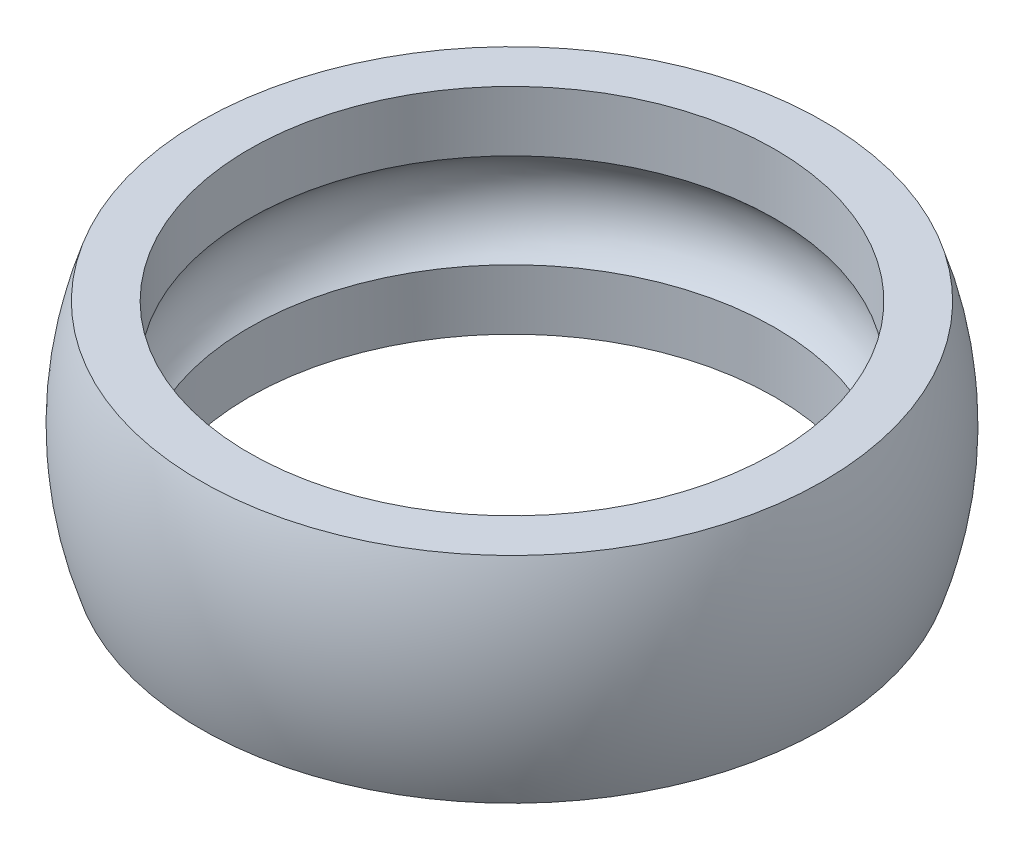
ISO-10303-21;
HEADER;
FILE_DESCRIPTION(('STEP AP214'),'2;1');
FILE_NAME('part.step','',(''),(''),'','','');
FILE_SCHEMA(('AUTOMOTIVE_DESIGN { 1 0 10303 214 1 1 1 1 }'));
ENDSEC;
DATA;
#1=APPLICATION_CONTEXT('core data for automotive mechanical design processes');
#2=APPLICATION_PROTOCOL_DEFINITION('international standard','automotive_design',2000,#1);
#3=PRODUCT_CONTEXT('',#1,'mechanical');
#4=PRODUCT('Part','Part','',(#3));
#5=PRODUCT_RELATED_PRODUCT_CATEGORY('part','',(#4));
#6=PRODUCT_DEFINITION_FORMATION('','',#4);
#7=PRODUCT_DEFINITION_CONTEXT('part definition',#1,'design');
#8=PRODUCT_DEFINITION('design','',#6,#7);
#9=PRODUCT_DEFINITION_SHAPE('','',#8);
#10=(LENGTH_UNIT() NAMED_UNIT(*) SI_UNIT(.MILLI.,.METRE.));
#11=(NAMED_UNIT(*) PLANE_ANGLE_UNIT() SI_UNIT($,.RADIAN.));
#12=(NAMED_UNIT(*) SI_UNIT($,.STERADIAN.) SOLID_ANGLE_UNIT());
#13=UNCERTAINTY_MEASURE_WITH_UNIT(LENGTH_MEASURE(1.E-05),#10,'distance_accuracy_value','');
#14=(GEOMETRIC_REPRESENTATION_CONTEXT(3) GLOBAL_UNCERTAINTY_ASSIGNED_CONTEXT((#13)) GLOBAL_UNIT_ASSIGNED_CONTEXT((#10,
#11,#12)) REPRESENTATION_CONTEXT('',''));
#15=CARTESIAN_POINT('',(0.,0.,0.));
#16=DIRECTION('',(0.,0.,1.));
#17=DIRECTION('',(1.,0.,0.));
#18=AXIS2_PLACEMENT_3D('',#15,#16,#17);
#19=CARTESIAN_POINT('',(0.,0.,0.));
#20=DIRECTION('',(0.,-1.,0.));
#21=DIRECTION('',(0.,0.,-1.));
#22=AXIS2_PLACEMENT_3D('',#19,#20,#21);
#23=CYLINDRICAL_SURFACE('',#22,8.57810102173755);
#24=CARTESIAN_POINT('',(0.,3.5,0.));
#25=DIRECTION('',(0.,-1.,0.));
#26=DIRECTION('',(1.,0.,0.));
#27=AXIS2_PLACEMENT_3D('',#24,#25,#26);
#28=CIRCLE('',#27,8.57810102173755);
#29=CARTESIAN_POINT('',(8.57810102173755,3.5,0.));
#30=VERTEX_POINT('',#29);
#31=EDGE_CURVE('E49',#30,#30,#28,.F.);
#32=ORIENTED_EDGE('',*,*,#31,.T.);
#33=EDGE_LOOP('',(#32));
#34=FACE_BOUND('',#33,.T.);
#35=CARTESIAN_POINT('',(0.,1.53832954149409,0.));
#36=DIRECTION('',(0.,-1.,0.));
#37=DIRECTION('',(0.,0.,-1.));
#38=AXIS2_PLACEMENT_3D('',#35,#36,#37);
#39=CIRCLE('',#38,8.57810102173755);
#40=CARTESIAN_POINT('',(0.,1.53832954149409,-8.57810102173755));
#41=VERTEX_POINT('',#40);
#42=EDGE_CURVE('E10',#41,#41,#39,.T.);
#43=ORIENTED_EDGE('',*,*,#42,.T.);
#44=EDGE_LOOP('',(#43));
#45=FACE_BOUND('',#44,.T.);
#46=ADVANCED_FACE('F45',(#34,#45),#23,.F.);
#47=CARTESIAN_POINT('',(0.,0.,0.));
#48=DIRECTION('',(0.,-1.,0.));
#49=DIRECTION('',(0.,0.,-1.));
#50=AXIS2_PLACEMENT_3D('',#47,#48,#49);
#51=TOROIDAL_SURFACE('',#50,7.3,2.);
#52=ORIENTED_EDGE('',*,*,#42,.F.);
#53=EDGE_LOOP('',(#52));
#54=FACE_BOUND('',#53,.T.);
#55=CARTESIAN_POINT('',(0.,-1.53832954149409,0.));
#56=DIRECTION('',(0.,-1.,0.));
#57=DIRECTION('',(0.,0.,-1.));
#58=AXIS2_PLACEMENT_3D('',#55,#56,#57);
#59=CIRCLE('',#58,8.57810102173755);
#60=CARTESIAN_POINT('',(0.,-1.53832954149409,-8.57810102173755));
#61=VERTEX_POINT('',#60);
#62=EDGE_CURVE('E53',#61,#61,#59,.T.);
#63=ORIENTED_EDGE('',*,*,#62,.T.);
#64=EDGE_LOOP('',(#63));
#65=FACE_BOUND('',#64,.T.);
#66=ADVANCED_FACE('F85',(#54,#65),#51,.F.);
#67=CARTESIAN_POINT('',(0.,0.,0.));
#68=DIRECTION('',(0.,-1.,0.));
#69=DIRECTION('',(0.,0.,-1.));
#70=AXIS2_PLACEMENT_3D('',#67,#68,#69);
#71=CYLINDRICAL_SURFACE('',#70,8.57810102173755);
#72=CARTESIAN_POINT('',(0.,-3.5,0.));
#73=DIRECTION('',(0.,1.,0.));
#74=DIRECTION('',(0.,0.,1.));
#75=AXIS2_PLACEMENT_3D('',#72,#73,#74);
#76=CIRCLE('',#75,8.57810102173755);
#77=CARTESIAN_POINT('',(0.,-3.5,8.57810102173755));
#78=VERTEX_POINT('',#77);
#79=EDGE_CURVE('E61',#78,#78,#76,.T.);
#80=ORIENTED_EDGE('',*,*,#79,.F.);
#81=EDGE_LOOP('',(#80));
#82=FACE_BOUND('',#81,.T.);
#83=ORIENTED_EDGE('',*,*,#62,.F.);
#84=EDGE_LOOP('',(#83));
#85=FACE_BOUND('',#84,.T.);
#86=ADVANCED_FACE('F90',(#82,#85),#71,.F.);
#87=CARTESIAN_POINT('',(-10.75,-3.5,-10.75));
#88=DIRECTION('',(0.,1.,0.));
#89=DIRECTION('',(0.,0.,1.));
#90=AXIS2_PLACEMENT_3D('',#87,#88,#89);
#91=PLANE('',#90);
#92=CARTESIAN_POINT('',(0.,-3.5,0.));
#93=DIRECTION('',(0.,1.,0.));
#94=DIRECTION('',(0.,0.,1.));
#95=AXIS2_PLACEMENT_3D('',#92,#93,#94);
#96=CIRCLE('',#95,10.1642756751281);
#97=CARTESIAN_POINT('',(10.1642756751281,-3.5,0.));
#98=VERTEX_POINT('',#97);
#99=EDGE_CURVE('E63',#98,#98,#96,.F.);
#100=ORIENTED_EDGE('',*,*,#99,.T.);
#101=EDGE_LOOP('',(#100));
#102=FACE_BOUND('',#101,.T.);
#103=ORIENTED_EDGE('',*,*,#79,.T.);
#104=EDGE_LOOP('',(#103));
#105=FACE_BOUND('',#104,.T.);
#106=ADVANCED_FACE('F82',(#102,#105),#91,.F.);
#107=CARTESIAN_POINT('',(10.75,3.5,-10.75));
#108=DIRECTION('',(0.,-1.,0.));
#109=DIRECTION('',(1.,0.,0.));
#110=AXIS2_PLACEMENT_3D('',#107,#108,#109);
#111=PLANE('',#110);
#112=CARTESIAN_POINT('',(0.,3.5,0.));
#113=DIRECTION('',(0.,-1.,0.));
#114=DIRECTION('',(1.,0.,0.));
#115=AXIS2_PLACEMENT_3D('',#112,#113,#114);
#116=CIRCLE('',#115,10.1642756751281);
#117=CARTESIAN_POINT('',(10.1642756751281,3.5,0.));
#118=VERTEX_POINT('',#117);
#119=EDGE_CURVE('E58',#118,#118,#116,.F.);
#120=ORIENTED_EDGE('',*,*,#119,.T.);
#121=EDGE_LOOP('',(#120));
#122=FACE_BOUND('',#121,.T.);
#123=ORIENTED_EDGE('',*,*,#31,.F.);
#124=EDGE_LOOP('',(#123));
#125=FACE_BOUND('',#124,.T.);
#126=ADVANCED_FACE('F74',(#122,#125),#111,.F.);
#127=CARTESIAN_POINT('',(0.,0.,0.));
#128=DIRECTION('',(0.,-1.,0.));
#129=DIRECTION('',(1.,0.,0.));
#130=AXIS2_PLACEMENT_3D('',#127,#128,#129);
#131=SPHERICAL_SURFACE('',#130,10.75);
#132=CARTESIAN_POINT('',(10.1642756751281,3.5,0.));
#133=CARTESIAN_POINT('',(10.1884568916153,3.42977620733797,0.));
#134=CARTESIAN_POINT('',(10.2119101335209,3.35930174603067,0.));
#135=CARTESIAN_POINT('',(10.2573510896654,3.21788192001971,0.));
#136=CARTESIAN_POINT('',(10.2793388039043,3.14693655531604,0.));
#137=CARTESIAN_POINT('',(10.3218391262122,3.00460535640646,0.));
#138=CARTESIAN_POINT('',(10.3423517342812,2.93321952220056,0.));
#139=CARTESIAN_POINT('',(10.3818930681106,2.79003806160062,0.));
#140=CARTESIAN_POINT('',(10.4009217938711,2.7182424352066,0.));
#141=CARTESIAN_POINT('',(10.4374871791895,2.57427222905891,0.));
#142=CARTESIAN_POINT('',(10.4550238387475,2.50209764930524,0.));
#143=CARTESIAN_POINT('',(10.4885975608385,2.35740054194882,0.));
#144=CARTESIAN_POINT('',(10.5046346233717,2.28487801434606,0.));
#145=CARTESIAN_POINT('',(10.535202261541,2.13951616523034,0.));
#146=CARTESIAN_POINT('',(10.5497328371772,2.06667684371738,0.));
#147=CARTESIAN_POINT('',(10.5772812597055,1.92071269708758,0.));
#148=CARTESIAN_POINT('',(10.5902991065975,1.84758787197074,0.));
#149=CARTESIAN_POINT('',(10.6148164793938,1.70108413101103,0.));
#150=CARTESIAN_POINT('',(10.626316005298,1.62770521516815,0.));
#151=CARTESIAN_POINT('',(10.6477917961763,1.48072481480631,0.));
#152=CARTESIAN_POINT('',(10.6577680611504,1.40712333028734,0.));
#153=CARTESIAN_POINT('',(10.6761930445703,1.25972941022872,0.));
#154=CARTESIAN_POINT('',(10.6846417630161,1.18593697468907,0.));
#155=CARTESIAN_POINT('',(10.7000080239879,1.03819285227452,0.));
#156=CARTESIAN_POINT('',(10.7069255665139,0.964241165399612,0.));
#157=CARTESIAN_POINT('',(10.7192265040144,0.816210308410605,0.));
#158=CARTESIAN_POINT('',(10.724609898989,0.742131138296505,0.));
#159=CARTESIAN_POINT('',(10.7338402287928,0.593877137689417,0.));
#160=CARTESIAN_POINT('',(10.7376871636221,0.519702307196429,0.));
#161=CARTESIAN_POINT('',(10.743842920573,0.371288849785533,0.));
#162=CARTESIAN_POINT('',(10.7461517426945,0.297050222867626,0.));
#163=CARTESIAN_POINT('',(10.749230282408,0.148541063966479,0.));
#164=CARTESIAN_POINT('',(10.75,0.074270531983239,0.));
#165=CARTESIAN_POINT('',(10.75,-0.0742705319832402,0.));
#166=CARTESIAN_POINT('',(10.749230282408,-0.14854106396648,0.));
#167=CARTESIAN_POINT('',(10.7461517426945,-0.297050222867627,0.));
#168=CARTESIAN_POINT('',(10.743842920573,-0.371288849785534,0.));
#169=CARTESIAN_POINT('',(10.7376871636221,-0.51970230719643,0.));
#170=CARTESIAN_POINT('',(10.7338402287928,-0.593877137689419,0.));
#171=CARTESIAN_POINT('',(10.724609898989,-0.742131138296507,0.));
#172=CARTESIAN_POINT('',(10.7192265040144,-0.816210308410606,0.));
#173=CARTESIAN_POINT('',(10.7069255665139,-0.964241165399613,0.));
#174=CARTESIAN_POINT('',(10.7000080239879,-1.03819285227452,0.));
#175=CARTESIAN_POINT('',(10.6846417630161,-1.18593697468908,0.));
#176=CARTESIAN_POINT('',(10.6761930445703,-1.25972941022872,0.));
#177=CARTESIAN_POINT('',(10.6577680611504,-1.40712333028734,0.));
#178=CARTESIAN_POINT('',(10.6477917961763,-1.48072481480631,0.));
#179=CARTESIAN_POINT('',(10.626316005298,-1.62770521516816,0.));
#180=CARTESIAN_POINT('',(10.6148164793938,-1.70108413101103,0.));
#181=CARTESIAN_POINT('',(10.5902991065975,-1.84758787197075,0.));
#182=CARTESIAN_POINT('',(10.5772812597055,-1.92071269708758,0.));
#183=CARTESIAN_POINT('',(10.5497328371772,-2.06667684371738,0.));
#184=CARTESIAN_POINT('',(10.535202261541,-2.13951616523034,0.));
#185=CARTESIAN_POINT('',(10.5046346233717,-2.28487801434606,0.));
#186=CARTESIAN_POINT('',(10.4885975608385,-2.35740054194882,0.));
#187=CARTESIAN_POINT('',(10.4550238387475,-2.50209764930525,0.));
#188=CARTESIAN_POINT('',(10.4374871791895,-2.57427222905891,0.));
#189=CARTESIAN_POINT('',(10.4009217938711,-2.7182424352066,0.));
#190=CARTESIAN_POINT('',(10.3818930681106,-2.79003806160062,0.));
#191=CARTESIAN_POINT('',(10.3423517342812,-2.93321952220056,0.));
#192=CARTESIAN_POINT('',(10.3218391262122,-3.00460535640646,0.));
#193=CARTESIAN_POINT('',(10.2793388039043,-3.14693655531604,0.));
#194=CARTESIAN_POINT('',(10.2573510896654,-3.21788192001971,0.));
#195=CARTESIAN_POINT('',(10.2119101335209,-3.35930174603068,0.));
#196=CARTESIAN_POINT('',(10.1884568916153,-3.42977620733797,0.));
#197=CARTESIAN_POINT('',(10.1642756751281,-3.5,0.));
#198=B_SPLINE_CURVE_WITH_KNOTS('',3,(#132,#133,#134,#135,#136,#137,#138,#139,#140,#141,#142,
#143,#144,#145,#146,#147,#148,#149,#150,#151,#152,#153,#154,#155,#156,#157,#158,#159,#160,#161,
#162,#163,#164,#165,#166,#167,#168,#169,#170,#171,#172,#173,#174,#175,#176,#177,#178,#179,#180,
#181,#182,#183,#184,#185,#186,#187,#188,#189,#190,#191,#192,#193,#194,#195,#196,#197),
.UNSPECIFIED.,.F.,.F.,(4,2,2,2,2,2,2,2,2,2,2,2,2,2,2,2,2,2,2,2,2,2,2,2,2,2,2,2,2,2,2,2,4),(0.,
0.222807607923646,0.445615215847291,0.668422823770937,0.891230431694583,1.11403803961823,
1.33684564754187,1.55965325546552,1.78246086338917,2.00526847131281,2.22807607923646,
2.4508836871601,2.67369129508375,2.8964989030074,3.11930651093104,3.34211411885469,
3.56492172677833,3.78772933470198,4.01053694262562,4.23334455054927,4.45615215847292,
4.67895976639656,4.90176737432021,5.12457498224385,5.3473825901675,5.57019019809115,
5.79299780601479,6.01580541393844,6.23861302186208,6.46142062978573,6.68422823770937,
6.90703584563302,7.12984345355666),.UNSPECIFIED.);
#199=EDGE_CURVE('BSEAM47',#118,#98,#198,.T.);
#200=ORIENTED_EDGE('',*,*,#119,.F.);
#201=ORIENTED_EDGE('',*,*,#99,.F.);
#202=ORIENTED_EDGE('',*,*,#199,.T.);
#203=ORIENTED_EDGE('',*,*,#199,.F.);
#204=EDGE_LOOP('',(#200,#202,#201,#203));
#205=FACE_BOUND('',#204,.T.);
#206=ADVANCED_FACE('F47',(#205),#131,.T.);
#207=CLOSED_SHELL('',(#46,#66,#86,#106,#126,#206));
#208=MANIFOLD_SOLID_BREP('B2',#207);
#209=ADVANCED_BREP_SHAPE_REPRESENTATION('',(#18,#208),#14);
#210=SHAPE_DEFINITION_REPRESENTATION(#9,#209);
ENDSEC;
END-ISO-10303-21;
